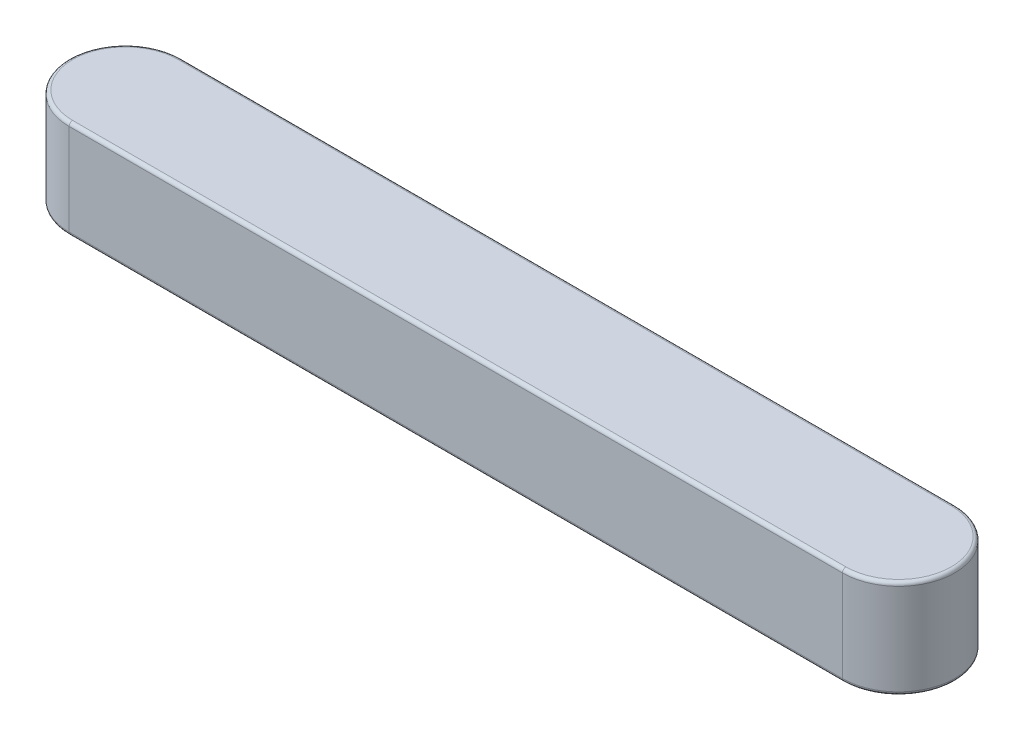
ISO-10303-21;
HEADER;
FILE_DESCRIPTION(('STEP AP214'),'2;1');
FILE_NAME('part.step','',(''),(''),'','','');
FILE_SCHEMA(('AUTOMOTIVE_DESIGN { 1 0 10303 214 1 1 1 1 }'));
ENDSEC;
DATA;
#1=APPLICATION_CONTEXT('core data for automotive mechanical design processes');
#2=APPLICATION_PROTOCOL_DEFINITION('international standard','automotive_design',2000,#1);
#3=PRODUCT_CONTEXT('',#1,'mechanical');
#4=PRODUCT('Part','Part','',(#3));
#5=PRODUCT_RELATED_PRODUCT_CATEGORY('part','',(#4));
#6=PRODUCT_DEFINITION_FORMATION('','',#4);
#7=PRODUCT_DEFINITION_CONTEXT('part definition',#1,'design');
#8=PRODUCT_DEFINITION('design','',#6,#7);
#9=PRODUCT_DEFINITION_SHAPE('','',#8);
#10=(LENGTH_UNIT() NAMED_UNIT(*) SI_UNIT(.MILLI.,.METRE.));
#11=(NAMED_UNIT(*) PLANE_ANGLE_UNIT() SI_UNIT($,.RADIAN.));
#12=(NAMED_UNIT(*) SI_UNIT($,.STERADIAN.) SOLID_ANGLE_UNIT());
#13=UNCERTAINTY_MEASURE_WITH_UNIT(LENGTH_MEASURE(1.E-05),#10,'distance_accuracy_value','');
#14=(GEOMETRIC_REPRESENTATION_CONTEXT(3) GLOBAL_UNCERTAINTY_ASSIGNED_CONTEXT((#13)) GLOBAL_UNIT_ASSIGNED_CONTEXT((#10,
#11,#12)) REPRESENTATION_CONTEXT('',''));
#15=CARTESIAN_POINT('',(0.,0.,0.));
#16=DIRECTION('',(0.,0.,1.));
#17=DIRECTION('',(1.,0.,0.));
#18=AXIS2_PLACEMENT_3D('',#15,#16,#17);
#19=CARTESIAN_POINT('',(-54.9999999999953,6.99999999999988,1.77635683940025E-12));
#20=DIRECTION('',(0.,-1.,0.));
#21=DIRECTION('',(0.,0.,-1.));
#22=AXIS2_PLACEMENT_3D('',#19,#20,#21);
#23=CYLINDRICAL_SURFACE('',#22,4.);
#24=DIRECTION('',(0.,-1.,0.));
#25=VECTOR('',#24,1.);
#26=CARTESIAN_POINT('',(-54.9999999999971,6.99999999999976,-3.99999999999845));
#27=LINE('',#26,#25);
#28=CARTESIAN_POINT('',(-54.9999999999971,6.74999999999976,-3.99999999999845));
#29=VERTEX_POINT('',#28);
#30=CARTESIAN_POINT('',(-55.0000000000024,0.249999999999764,-4.00000000000178));
#31=VERTEX_POINT('',#30);
#32=EDGE_CURVE('E95',#29,#31,#27,.T.);
#33=ORIENTED_EDGE('',*,*,#32,.T.);
#34=CARTESIAN_POINT('',(-55.0000000000059,0.250000000000354,-4.66293670342566E-12));
#35=DIRECTION('',(0.,1.,0.));
#36=DIRECTION('',(0.,0.,1.));
#37=AXIS2_PLACEMENT_3D('',#34,#35,#36);
#38=CIRCLE('',#37,4.);
#39=CARTESIAN_POINT('',(-54.9999999999997,0.250000000000011,3.99999999999978));
#40=VERTEX_POINT('',#39);
#41=EDGE_CURVE('E89',#31,#40,#38,.T.);
#42=ORIENTED_EDGE('',*,*,#41,.T.);
#43=DIRECTION('',(0.,-1.,0.));
#44=VECTOR('',#43,1.);
#45=CARTESIAN_POINT('',(-54.9999999999997,7.00000000000018,3.99999999999956));
#46=LINE('',#45,#44);
#47=CARTESIAN_POINT('',(-54.9999999999997,6.75000000000018,3.99999999999956));
#48=VERTEX_POINT('',#47);
#49=EDGE_CURVE('E11',#48,#40,#46,.T.);
#50=ORIENTED_EDGE('',*,*,#49,.F.);
#51=CARTESIAN_POINT('',(-54.9999999999953,6.74999999999988,1.77635683940025E-12));
#52=DIRECTION('',(0.,-1.,0.));
#53=DIRECTION('',(0.,0.,1.));
#54=AXIS2_PLACEMENT_3D('',#51,#52,#53);
#55=CIRCLE('',#54,4.);
#56=EDGE_CURVE('E425',#48,#29,#55,.T.);
#57=ORIENTED_EDGE('',*,*,#56,.T.);
#58=EDGE_LOOP('',(#33,#42,#50,#57));
#59=FACE_BOUND('',#58,.T.);
#60=ADVANCED_FACE('F17',(#59),#23,.T.);
#61=CARTESIAN_POINT('',(-54.9999999999997,7.00000000000018,3.99999999999956));
#62=DIRECTION('',(0.,0.,-1.));
#63=DIRECTION('',(0.,-1.,0.));
#64=AXIS2_PLACEMENT_3D('',#61,#62,#63);
#65=PLANE('',#64);
#66=ORIENTED_EDGE('',*,*,#49,.T.);
#67=DIRECTION('',(1.,0.,0.));
#68=VECTOR('',#67,1.);
#69=CARTESIAN_POINT('',(-54.9999999999997,0.250000000000011,3.99999999999978));
#70=LINE('',#69,#68);
#71=CARTESIAN_POINT('',(2.66453525910038E-12,0.249999999999775,4.00000000000045));
#72=VERTEX_POINT('',#71);
#73=EDGE_CURVE('E71',#40,#72,#70,.T.);
#74=ORIENTED_EDGE('',*,*,#73,.T.);
#75=DIRECTION('',(0.,-1.,0.));
#76=VECTOR('',#75,1.);
#77=CARTESIAN_POINT('',(1.77635683940025E-12,6.99999999999988,4.00000000000067));
#78=LINE('',#77,#76);
#79=CARTESIAN_POINT('',(8.88178419700125E-13,6.74999999999988,3.99999999999845));
#80=VERTEX_POINT('',#79);
#81=EDGE_CURVE('E27',#80,#72,#78,.T.);
#82=ORIENTED_EDGE('',*,*,#81,.F.);
#83=DIRECTION('',(-1.,0.,0.));
#84=VECTOR('',#83,1.);
#85=CARTESIAN_POINT('',(-54.9999999999997,6.75000000000018,3.99999999999956));
#86=LINE('',#85,#84);
#87=EDGE_CURVE('E74',#80,#48,#86,.T.);
#88=ORIENTED_EDGE('',*,*,#87,.T.);
#89=EDGE_LOOP('',(#66,#74,#82,#88));
#90=FACE_BOUND('',#89,.T.);
#91=ADVANCED_FACE('F68',(#90),#65,.F.);
#92=CARTESIAN_POINT('',(0.,7.00000000000006,0.));
#93=DIRECTION('',(0.,-1.,0.));
#94=DIRECTION('',(0.,0.,-1.));
#95=AXIS2_PLACEMENT_3D('',#92,#93,#94);
#96=CYLINDRICAL_SURFACE('',#95,4.);
#97=ORIENTED_EDGE('',*,*,#81,.T.);
#98=CARTESIAN_POINT('',(0.,0.25,0.));
#99=DIRECTION('',(0.,1.,0.));
#100=DIRECTION('',(0.,0.,1.));
#101=AXIS2_PLACEMENT_3D('',#98,#99,#100);
#102=CIRCLE('',#101,4.);
#103=CARTESIAN_POINT('',(0.,0.249999999999764,-4.00000000000089));
#104=VERTEX_POINT('',#103);
#105=EDGE_CURVE('E119',#72,#104,#102,.T.);
#106=ORIENTED_EDGE('',*,*,#105,.T.);
#107=DIRECTION('',(0.,-1.,0.));
#108=VECTOR('',#107,1.);
#109=CARTESIAN_POINT('',(0.,7.00000000000018,-4.00000000000089));
#110=LINE('',#109,#108);
#111=CARTESIAN_POINT('',(0.,6.75000000000018,-4.00000000000089));
#112=VERTEX_POINT('',#111);
#113=EDGE_CURVE('E87',#112,#104,#110,.T.);
#114=ORIENTED_EDGE('',*,*,#113,.F.);
#115=CARTESIAN_POINT('',(0.,6.75000000000006,0.));
#116=DIRECTION('',(0.,-1.,0.));
#117=DIRECTION('',(0.,0.,1.));
#118=AXIS2_PLACEMENT_3D('',#115,#116,#117);
#119=CIRCLE('',#118,4.);
#120=EDGE_CURVE('E462',#112,#80,#119,.T.);
#121=ORIENTED_EDGE('',*,*,#120,.T.);
#122=EDGE_LOOP('',(#97,#106,#114,#121));
#123=FACE_BOUND('',#122,.T.);
#124=ADVANCED_FACE('F185',(#123),#96,.T.);
#125=CARTESIAN_POINT('',(-54.9999999999971,6.99999999999976,-3.99999999999845));
#126=DIRECTION('',(0.,0.,1.));
#127=DIRECTION('',(0.,-1.,0.));
#128=AXIS2_PLACEMENT_3D('',#125,#126,#127);
#129=PLANE('',#128);
#130=ORIENTED_EDGE('',*,*,#113,.T.);
#131=DIRECTION('',(-1.,0.,0.));
#132=VECTOR('',#131,1.);
#133=CARTESIAN_POINT('',(-55.0000000000024,0.249999999999764,-4.00000000000178));
#134=LINE('',#133,#132);
#135=EDGE_CURVE('E105',#104,#31,#134,.T.);
#136=ORIENTED_EDGE('',*,*,#135,.T.);
#137=ORIENTED_EDGE('',*,*,#32,.F.);
#138=DIRECTION('',(1.,0.,0.));
#139=VECTOR('',#138,1.);
#140=CARTESIAN_POINT('',(0.,6.75000000000018,-4.00000000000089));
#141=LINE('',#140,#139);
#142=EDGE_CURVE('E431',#29,#112,#141,.T.);
#143=ORIENTED_EDGE('',*,*,#142,.T.);
#144=EDGE_LOOP('',(#130,#136,#137,#143));
#145=FACE_BOUND('',#144,.T.);
#146=ADVANCED_FACE('F186',(#145),#129,.F.);
#147=CARTESIAN_POINT('',(-54.9999999999953,6.99999999999988,1.77635683940025E-12));
#148=DIRECTION('',(0.,1.,0.));
#149=DIRECTION('',(0.,0.,-1.));
#150=AXIS2_PLACEMENT_3D('',#147,#148,#149);
#151=PLANE('',#150);
#152=DIRECTION('',(1.,0.,0.));
#153=VECTOR('',#152,1.);
#154=CARTESIAN_POINT('',(1.77635683940025E-12,7.00000000000035,3.7499999999997));
#155=LINE('',#154,#153);
#156=CARTESIAN_POINT('',(-54.9999999999953,6.99999999999977,3.75000000000236));
#157=VERTEX_POINT('',#156);
#158=CARTESIAN_POINT('',(1.77635683940025E-12,7.00000000000035,3.7499999999997));
#159=VERTEX_POINT('',#158);
#160=EDGE_CURVE('E412',#157,#159,#155,.T.);
#161=ORIENTED_EDGE('',*,*,#160,.T.);
#162=CARTESIAN_POINT('',(0.,7.00000000000006,0.));
#163=DIRECTION('',(0.,1.,0.));
#164=DIRECTION('',(0.,0.,1.));
#165=AXIS2_PLACEMENT_3D('',#162,#163,#164);
#166=CIRCLE('',#165,3.75);
#167=CARTESIAN_POINT('',(0.,6.99999999999977,-3.75000000000014));
#168=VERTEX_POINT('',#167);
#169=EDGE_CURVE('E468',#159,#168,#166,.T.);
#170=ORIENTED_EDGE('',*,*,#169,.T.);
#171=DIRECTION('',(-1.,0.,0.));
#172=VECTOR('',#171,1.);
#173=CARTESIAN_POINT('',(-54.9999999999944,6.99999999999977,-3.74999999999814));
#174=LINE('',#173,#172);
#175=CARTESIAN_POINT('',(-54.9999999999944,6.99999999999977,-3.74999999999814));
#176=VERTEX_POINT('',#175);
#177=EDGE_CURVE('E418',#168,#176,#174,.T.);
#178=ORIENTED_EDGE('',*,*,#177,.T.);
#179=CARTESIAN_POINT('',(-54.9999999999953,6.99999999999988,1.77635683940025E-12));
#180=DIRECTION('',(0.,1.,0.));
#181=DIRECTION('',(0.,0.,1.));
#182=AXIS2_PLACEMENT_3D('',#179,#180,#181);
#183=CIRCLE('',#182,3.75);
#184=EDGE_CURVE('E411',#176,#157,#183,.T.);
#185=ORIENTED_EDGE('',*,*,#184,.T.);
#186=EDGE_LOOP('',(#161,#170,#178,#185));
#187=FACE_BOUND('',#186,.T.);
#188=ADVANCED_FACE('F150',(#187),#151,.T.);
#189=CARTESIAN_POINT('',(-55.0000000000059,3.53883589099269E-13,-4.66293670342566E-12));
#190=DIRECTION('',(0.,1.,0.));
#191=DIRECTION('',(0.,0.,-1.));
#192=AXIS2_PLACEMENT_3D('',#189,#190,#191);
#193=PLANE('',#192);
#194=CARTESIAN_POINT('',(-55.0000000000059,3.53883589099269E-13,-4.66293670342566E-12));
#195=DIRECTION('',(0.,-1.,0.));
#196=DIRECTION('',(0.,0.,1.));
#197=AXIS2_PLACEMENT_3D('',#194,#195,#196);
#198=CIRCLE('',#197,3.75);
#199=CARTESIAN_POINT('',(-54.9999999999962,6.00214322687975E-13,3.7500000000017));
#200=VERTEX_POINT('',#199);
#201=CARTESIAN_POINT('',(-54.9999999999944,-2.35922392732846E-13,-3.74999999999814));
#202=VERTEX_POINT('',#201);
#203=EDGE_CURVE('E100',#200,#202,#198,.T.);
#204=ORIENTED_EDGE('',*,*,#203,.T.);
#205=DIRECTION('',(1.,0.,0.));
#206=VECTOR('',#205,1.);
#207=CARTESIAN_POINT('',(-54.9999999999944,-2.35922392732846E-13,-3.74999999999814));
#208=LINE('',#207,#206);
#209=CARTESIAN_POINT('',(0.,-2.35922392732846E-13,-3.75000000000014));
#210=VERTEX_POINT('',#209);
#211=EDGE_CURVE('E445',#202,#210,#208,.T.);
#212=ORIENTED_EDGE('',*,*,#211,.T.);
#213=CARTESIAN_POINT('',(0.,0.,0.));
#214=DIRECTION('',(0.,-1.,0.));
#215=DIRECTION('',(0.,0.,1.));
#216=AXIS2_PLACEMENT_3D('',#213,#214,#215);
#217=CIRCLE('',#216,3.75);
#218=CARTESIAN_POINT('',(3.5527136788005E-12,-2.25514051876985E-13,3.75000000000214));
#219=VERTEX_POINT('',#218);
#220=EDGE_CURVE('E113',#210,#219,#217,.T.);
#221=ORIENTED_EDGE('',*,*,#220,.T.);
#222=DIRECTION('',(-1.,0.,0.));
#223=VECTOR('',#222,1.);
#224=CARTESIAN_POINT('',(-54.9999999999962,6.00214322687975E-13,3.7500000000017));
#225=LINE('',#224,#223);
#226=EDGE_CURVE('E39',#219,#200,#225,.T.);
#227=ORIENTED_EDGE('',*,*,#226,.T.);
#228=EDGE_LOOP('',(#204,#212,#221,#227));
#229=FACE_BOUND('',#228,.T.);
#230=ADVANCED_FACE('F142',(#229),#193,.F.);
#231=CARTESIAN_POINT('',(-54.9999999999962,0.2500000000006,3.7500000000017));
#232=DIRECTION('',(1.,0.,0.));
#233=DIRECTION('',(0.,0.,-1.));
#234=AXIS2_PLACEMENT_3D('',#231,#232,#233);
#235=CYLINDRICAL_SURFACE('',#234,0.25);
#236=CARTESIAN_POINT('',(-54.9999999999962,0.2500000000006,3.7500000000017));
#237=DIRECTION('',(-1.,0.,0.));
#238=DIRECTION('',(0.,0.,1.));
#239=AXIS2_PLACEMENT_3D('',#236,#237,#238);
#240=CIRCLE('',#239,0.25);
#241=EDGE_CURVE('E83',#200,#40,#240,.T.);
#242=ORIENTED_EDGE('',*,*,#241,.F.);
#243=ORIENTED_EDGE('',*,*,#226,.F.);
#244=CARTESIAN_POINT('',(3.5527136788005E-12,0.249999999999775,3.75000000000214));
#245=DIRECTION('',(1.,0.,0.));
#246=DIRECTION('',(0.,0.,-1.));
#247=AXIS2_PLACEMENT_3D('',#244,#245,#246);
#248=CIRCLE('',#247,0.25);
#249=EDGE_CURVE('E84',#72,#219,#248,.T.);
#250=ORIENTED_EDGE('',*,*,#249,.F.);
#251=ORIENTED_EDGE('',*,*,#73,.F.);
#252=EDGE_LOOP('',(#242,#243,#250,#251));
#253=FACE_BOUND('',#252,.T.);
#254=ADVANCED_FACE('F81',(#253),#235,.T.);
#255=CARTESIAN_POINT('',(0.,0.25,0.));
#256=DIRECTION('',(0.,1.,0.));
#257=DIRECTION('',(0.,0.,1.));
#258=AXIS2_PLACEMENT_3D('',#255,#256,#257);
#259=TOROIDAL_SURFACE('',#258,3.75,0.25);
#260=ORIENTED_EDGE('',*,*,#249,.T.);
#261=ORIENTED_EDGE('',*,*,#220,.F.);
#262=CARTESIAN_POINT('',(0.,0.249999999999764,-3.75000000000014));
#263=DIRECTION('',(-1.,0.,0.));
#264=DIRECTION('',(0.,0.,1.));
#265=AXIS2_PLACEMENT_3D('',#262,#263,#264);
#266=CIRCLE('',#265,0.25);
#267=EDGE_CURVE('E423',#104,#210,#266,.T.);
#268=ORIENTED_EDGE('',*,*,#267,.F.);
#269=ORIENTED_EDGE('',*,*,#105,.F.);
#270=EDGE_LOOP('',(#260,#261,#268,#269));
#271=FACE_BOUND('',#270,.T.);
#272=ADVANCED_FACE('F230',(#271),#259,.T.);
#273=CARTESIAN_POINT('',(-55.0000000000059,0.250000000000354,-4.66293670342566E-12));
#274=DIRECTION('',(0.,1.,0.));
#275=DIRECTION('',(0.,0.,1.));
#276=AXIS2_PLACEMENT_3D('',#273,#274,#275);
#277=TOROIDAL_SURFACE('',#276,3.75,0.25);
#278=ORIENTED_EDGE('',*,*,#241,.T.);
#279=ORIENTED_EDGE('',*,*,#41,.F.);
#280=CARTESIAN_POINT('',(-54.9999999999944,0.249999999999764,-3.74999999999814));
#281=DIRECTION('',(1.,0.,0.));
#282=DIRECTION('',(0.,0.,-1.));
#283=AXIS2_PLACEMENT_3D('',#280,#281,#282);
#284=CIRCLE('',#283,0.25);
#285=EDGE_CURVE('E110',#202,#31,#284,.T.);
#286=ORIENTED_EDGE('',*,*,#285,.F.);
#287=ORIENTED_EDGE('',*,*,#203,.F.);
#288=EDGE_LOOP('',(#278,#279,#286,#287));
#289=FACE_BOUND('',#288,.T.);
#290=ADVANCED_FACE('F99',(#289),#277,.T.);
#291=CARTESIAN_POINT('',(-54.9999999999944,0.249999999999764,-3.74999999999814));
#292=DIRECTION('',(-1.,0.,0.));
#293=DIRECTION('',(0.,0.,1.));
#294=AXIS2_PLACEMENT_3D('',#291,#292,#293);
#295=CYLINDRICAL_SURFACE('',#294,0.25);
#296=ORIENTED_EDGE('',*,*,#267,.T.);
#297=ORIENTED_EDGE('',*,*,#211,.F.);
#298=ORIENTED_EDGE('',*,*,#285,.T.);
#299=ORIENTED_EDGE('',*,*,#135,.F.);
#300=EDGE_LOOP('',(#296,#297,#298,#299));
#301=FACE_BOUND('',#300,.T.);
#302=ADVANCED_FACE('F207',(#301),#295,.T.);
#303=CARTESIAN_POINT('',(-54.9999999999953,6.74999999999988,1.77635683940025E-12));
#304=DIRECTION('',(0.,1.,0.));
#305=DIRECTION('',(0.,0.,1.));
#306=AXIS2_PLACEMENT_3D('',#303,#304,#305);
#307=TOROIDAL_SURFACE('',#306,3.75,0.25);
#308=CARTESIAN_POINT('',(-54.9999999999944,6.74999999999977,-3.74999999999814));
#309=DIRECTION('',(1.,0.,0.));
#310=DIRECTION('',(0.,0.,-1.));
#311=AXIS2_PLACEMENT_3D('',#308,#309,#310);
#312=CIRCLE('',#311,0.25);
#313=EDGE_CURVE('E446',#29,#176,#312,.T.);
#314=ORIENTED_EDGE('',*,*,#313,.F.);
#315=ORIENTED_EDGE('',*,*,#56,.F.);
#316=CARTESIAN_POINT('',(-54.9999999999953,6.74999999999976,3.75000000000236));
#317=DIRECTION('',(1.,0.,0.));
#318=DIRECTION('',(0.,0.,-1.));
#319=AXIS2_PLACEMENT_3D('',#316,#317,#318);
#320=CIRCLE('',#319,0.25);
#321=EDGE_CURVE('E422',#157,#48,#320,.T.);
#322=ORIENTED_EDGE('',*,*,#321,.F.);
#323=ORIENTED_EDGE('',*,*,#184,.F.);
#324=EDGE_LOOP('',(#314,#315,#322,#323));
#325=FACE_BOUND('',#324,.T.);
#326=ADVANCED_FACE('F196',(#325),#307,.T.);
#327=CARTESIAN_POINT('',(-54.9999999999953,6.74999999999976,3.75000000000236));
#328=DIRECTION('',(-1.,0.,0.));
#329=DIRECTION('',(0.,0.,1.));
#330=AXIS2_PLACEMENT_3D('',#327,#328,#329);
#331=CYLINDRICAL_SURFACE('',#330,0.25);
#332=ORIENTED_EDGE('',*,*,#321,.T.);
#333=ORIENTED_EDGE('',*,*,#87,.F.);
#334=CARTESIAN_POINT('',(1.77635683940025E-12,6.75000000000035,3.7499999999997));
#335=DIRECTION('',(1.,0.,0.));
#336=DIRECTION('',(0.,0.,-1.));
#337=AXIS2_PLACEMENT_3D('',#334,#335,#336);
#338=CIRCLE('',#337,0.25);
#339=EDGE_CURVE('E430',#159,#80,#338,.T.);
#340=ORIENTED_EDGE('',*,*,#339,.F.);
#341=ORIENTED_EDGE('',*,*,#160,.F.);
#342=EDGE_LOOP('',(#332,#333,#340,#341));
#343=FACE_BOUND('',#342,.T.);
#344=ADVANCED_FACE('F174',(#343),#331,.T.);
#345=CARTESIAN_POINT('',(-54.9999999999944,6.74999999999977,-3.74999999999814));
#346=DIRECTION('',(1.,0.,0.));
#347=DIRECTION('',(0.,0.,-1.));
#348=AXIS2_PLACEMENT_3D('',#345,#346,#347);
#349=CYLINDRICAL_SURFACE('',#348,0.25);
#350=ORIENTED_EDGE('',*,*,#313,.T.);
#351=ORIENTED_EDGE('',*,*,#177,.F.);
#352=CARTESIAN_POINT('',(0.,6.74999999999977,-3.75000000000014));
#353=DIRECTION('',(1.,0.,0.));
#354=DIRECTION('',(0.,0.,-1.));
#355=AXIS2_PLACEMENT_3D('',#352,#353,#354);
#356=CIRCLE('',#355,0.25);
#357=EDGE_CURVE('E466',#112,#168,#356,.T.);
#358=ORIENTED_EDGE('',*,*,#357,.F.);
#359=ORIENTED_EDGE('',*,*,#142,.F.);
#360=EDGE_LOOP('',(#350,#351,#358,#359));
#361=FACE_BOUND('',#360,.T.);
#362=ADVANCED_FACE('F165',(#361),#349,.T.);
#363=CARTESIAN_POINT('',(0.,6.75000000000006,0.));
#364=DIRECTION('',(0.,1.,0.));
#365=DIRECTION('',(0.,0.,1.));
#366=AXIS2_PLACEMENT_3D('',#363,#364,#365);
#367=TOROIDAL_SURFACE('',#366,3.75,0.25);
#368=ORIENTED_EDGE('',*,*,#339,.T.);
#369=ORIENTED_EDGE('',*,*,#120,.F.);
#370=ORIENTED_EDGE('',*,*,#357,.T.);
#371=ORIENTED_EDGE('',*,*,#169,.F.);
#372=EDGE_LOOP('',(#368,#369,#370,#371));
#373=FACE_BOUND('',#372,.T.);
#374=ADVANCED_FACE('F160',(#373),#367,.T.);
#375=CLOSED_SHELL('',(#60,#91,#124,#146,#188,#230,#254,#272,#290,#302,#326,#344,#362,#374));
#376=MANIFOLD_SOLID_BREP('B1',#375);
#377=ADVANCED_BREP_SHAPE_REPRESENTATION('',(#18,#376),#14);
#378=SHAPE_DEFINITION_REPRESENTATION(#9,#377);
ENDSEC;
END-ISO-10303-21;
